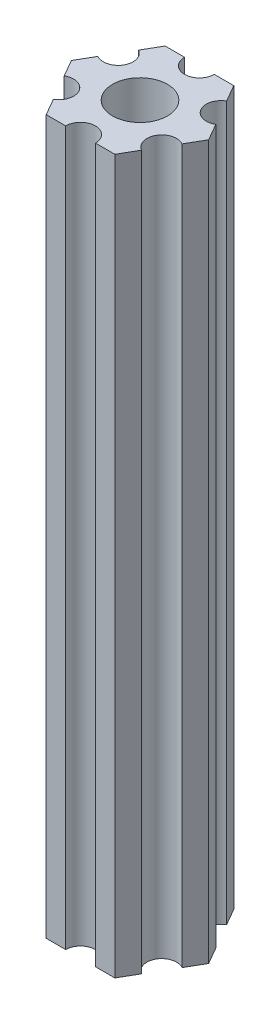
ISO-10303-21;
HEADER;
FILE_DESCRIPTION(('STEP AP214'),'2;1');
FILE_NAME('part.step','',(''),(''),'','','');
FILE_SCHEMA(('AUTOMOTIVE_DESIGN { 1 0 10303 214 1 1 1 1 }'));
ENDSEC;
DATA;
#1=APPLICATION_CONTEXT('core data for automotive mechanical design processes');
#2=APPLICATION_PROTOCOL_DEFINITION('international standard','automotive_design',2000,#1);
#3=PRODUCT_CONTEXT('',#1,'mechanical');
#4=PRODUCT('Part','Part','',(#3));
#5=PRODUCT_RELATED_PRODUCT_CATEGORY('part','',(#4));
#6=PRODUCT_DEFINITION_FORMATION('','',#4);
#7=PRODUCT_DEFINITION_CONTEXT('part definition',#1,'design');
#8=PRODUCT_DEFINITION('design','',#6,#7);
#9=PRODUCT_DEFINITION_SHAPE('','',#8);
#10=(LENGTH_UNIT() NAMED_UNIT(*) SI_UNIT(.MILLI.,.METRE.));
#11=(NAMED_UNIT(*) PLANE_ANGLE_UNIT() SI_UNIT($,.RADIAN.));
#12=(NAMED_UNIT(*) SI_UNIT($,.STERADIAN.) SOLID_ANGLE_UNIT());
#13=UNCERTAINTY_MEASURE_WITH_UNIT(LENGTH_MEASURE(1.E-05),#10,'distance_accuracy_value','');
#14=(GEOMETRIC_REPRESENTATION_CONTEXT(3) GLOBAL_UNCERTAINTY_ASSIGNED_CONTEXT((#13)) GLOBAL_UNIT_ASSIGNED_CONTEXT((#10,
#11,#12)) REPRESENTATION_CONTEXT('',''));
#15=CARTESIAN_POINT('',(0.,0.,0.));
#16=DIRECTION('',(0.,0.,1.));
#17=DIRECTION('',(1.,0.,0.));
#18=AXIS2_PLACEMENT_3D('',#15,#16,#17);
#19=CARTESIAN_POINT('',(-5.49926150638083,76.2,3.17499966684068));
#20=DIRECTION('',(0.,-1.,0.));
#21=DIRECTION('',(0.,0.,-1.));
#22=AXIS2_PLACEMENT_3D('',#19,#20,#21);
#23=PLANE('',#22);
#24=CARTESIAN_POINT('',(-5.49926150638083,76.2,3.17499966684068));
#25=DIRECTION('',(0.,-1.,0.));
#26=DIRECTION('',(0.,0.,-1.));
#27=AXIS2_PLACEMENT_3D('',#24,#25,#26);
#28=CIRCLE('',#27,1.58750000000001);
#29=CARTESIAN_POINT('',(-6.29301142309098,76.2,1.80018429024546));
#30=VERTEX_POINT('',#29);
#31=CARTESIAN_POINT('',(-4.70551158967068,76.2,4.54981504343589));
#32=VERTEX_POINT('',#31);
#33=EDGE_CURVE('E230',#30,#32,#28,.T.);
#34=ORIENTED_EDGE('',*,*,#33,.T.);
#35=DIRECTION('',(0.499999947533953,0.,0.866025434075723));
#36=VECTOR('',#35,1.);
#37=CARTESIAN_POINT('',(-4.70551158967068,76.2,4.54981504343589));
#38=LINE('',#37,#36);
#39=CARTESIAN_POINT('',(-3.66617452134693,76.2,6.34999990382519));
#40=VERTEX_POINT('',#39);
#41=EDGE_CURVE('E128',#32,#40,#38,.T.);
#42=ORIENTED_EDGE('',*,*,#41,.T.);
#43=DIRECTION('',(1.,0.,0.));
#44=VECTOR('',#43,1.);
#45=CARTESIAN_POINT('',(-3.66617452134693,76.2,6.34999990382519));
#46=LINE('',#45,#44);
#47=CARTESIAN_POINT('',(-1.58750192349631,76.2,6.34999990382519));
#48=VERTEX_POINT('',#47);
#49=EDGE_CURVE('E275',#40,#48,#46,.T.);
#50=ORIENTED_EDGE('',*,*,#49,.T.);
#51=CARTESIAN_POINT('',(-3.84699262029331E-07,76.2,6.34999990382519));
#52=DIRECTION('',(0.,-1.,0.));
#53=DIRECTION('',(0.,0.,-1.));
#54=AXIS2_PLACEMENT_3D('',#51,#52,#53);
#55=CIRCLE('',#54,1.58750153879705);
#56=CARTESIAN_POINT('',(1.58750153879705,76.2,6.34999990382519));
#57=VERTEX_POINT('',#56);
#58=EDGE_CURVE('E294',#48,#57,#55,.T.);
#59=ORIENTED_EDGE('',*,*,#58,.T.);
#60=DIRECTION('',(1.,0.,0.));
#61=VECTOR('',#60,1.);
#62=CARTESIAN_POINT('',(1.58750153879705,76.2,6.34999990382519));
#63=LINE('',#62,#61);
#64=CARTESIAN_POINT('',(3.66617382465481,76.2,6.34999990382519));
#65=VERTEX_POINT('',#64);
#66=EDGE_CURVE('E291',#57,#65,#63,.T.);
#67=ORIENTED_EDGE('',*,*,#66,.T.);
#68=DIRECTION('',(0.5,0.,-0.866025403784439));
#69=VECTOR('',#68,1.);
#70=CARTESIAN_POINT('',(3.66617382465481,76.2,6.34999990382519));
#71=LINE('',#70,#69);
#72=CARTESIAN_POINT('',(4.70551092933191,76.2,4.54981523233291));
#73=VERTEX_POINT('',#72);
#74=EDGE_CURVE('E293',#65,#73,#71,.T.);
#75=ORIENTED_EDGE('',*,*,#74,.T.);
#76=CARTESIAN_POINT('',(5.49926092933191,76.2,3.17499990382512));
#77=DIRECTION('',(0.,-1.,0.));
#78=DIRECTION('',(0.,0.,-1.));
#79=AXIS2_PLACEMENT_3D('',#76,#77,#78);
#80=CIRCLE('',#79,1.5875);
#81=CARTESIAN_POINT('',(6.29301092933191,76.2,1.80018457531732));
#82=VERTEX_POINT('',#81);
#83=EDGE_CURVE('E296',#73,#82,#80,.T.);
#84=ORIENTED_EDGE('',*,*,#83,.T.);
#85=DIRECTION('',(0.5,0.,-0.866025403784438));
#86=VECTOR('',#85,1.);
#87=CARTESIAN_POINT('',(6.29301092933191,76.2,1.80018457531732));
#88=LINE('',#87,#86);
#89=CARTESIAN_POINT('',(7.33234803400895,76.2,-9.61748367576953E-08));
#90=VERTEX_POINT('',#89);
#91=EDGE_CURVE('E302',#82,#90,#88,.T.);
#92=ORIENTED_EDGE('',*,*,#91,.T.);
#93=DIRECTION('',(-0.499999921300921,0.,-0.866025449221368));
#94=VECTOR('',#93,1.);
#95=CARTESIAN_POINT('',(7.33234803400895,76.2,-9.61748367576953E-08));
#96=LINE('',#95,#94);
#97=CARTESIAN_POINT('',(6.29301117773375,76.2,-1.80018471521667));
#98=VERTEX_POINT('',#97);
#99=EDGE_CURVE('E304',#90,#98,#96,.T.);
#100=ORIENTED_EDGE('',*,*,#99,.T.);
#101=CARTESIAN_POINT('',(5.49926130266854,76.2,-3.1750001158556));
#102=DIRECTION('',(0.,-1.,0.));
#103=DIRECTION('',(0.,0.,-1.));
#104=AXIS2_PLACEMENT_3D('',#101,#102,#103);
#105=CIRCLE('',#104,1.5875);
#106=CARTESIAN_POINT('',(4.70551142760333,76.2,-4.54981551649452));
#107=VERTEX_POINT('',#106);
#108=EDGE_CURVE('E306',#98,#107,#105,.T.);
#109=ORIENTED_EDGE('',*,*,#108,.T.);
#110=DIRECTION('',(-0.499999921300921,0.,-0.866025449221368));
#111=VECTOR('',#110,1.);
#112=CARTESIAN_POINT('',(4.70551142760333,76.2,-4.54981551649452));
#113=LINE('',#112,#111);
#114=CARTESIAN_POINT('',(3.66617452134701,76.2,-6.35000022210623));
#115=VERTEX_POINT('',#114);
#116=EDGE_CURVE('E308',#107,#115,#113,.T.);
#117=ORIENTED_EDGE('',*,*,#116,.T.);
#118=DIRECTION('',(-1.,0.,0.));
#119=VECTOR('',#118,1.);
#120=CARTESIAN_POINT('',(3.66617452134701,76.2,-6.35000022210623));
#121=LINE('',#120,#119);
#122=CARTESIAN_POINT('',(1.58749884590197,76.2,-6.35000022210623));
#123=VERTEX_POINT('',#122);
#124=EDGE_CURVE('E310',#115,#123,#121,.T.);
#125=ORIENTED_EDGE('',*,*,#124,.T.);
#126=CARTESIAN_POINT('',(3.84699344862377E-07,76.2,-6.35000022210623));
#127=DIRECTION('',(0.,-1.,0.));
#128=DIRECTION('',(0.,0.,-1.));
#129=AXIS2_PLACEMENT_3D('',#126,#127,#128);
#130=CIRCLE('',#129,1.58749846120262);
#131=CARTESIAN_POINT('',(-1.58749846120262,76.2,-6.35000022210623));
#132=VERTEX_POINT('',#131);
#133=EDGE_CURVE('E312',#123,#132,#130,.T.);
#134=ORIENTED_EDGE('',*,*,#133,.T.);
#135=DIRECTION('',(-1.,0.,0.));
#136=VECTOR('',#135,1.);
#137=CARTESIAN_POINT('',(-1.58749846120262,76.2,-6.35000022210623));
#138=LINE('',#137,#136);
#139=CARTESIAN_POINT('',(-3.66617382465472,76.2,-6.35000022210623));
#140=VERTEX_POINT('',#139);
#141=EDGE_CURVE('E314',#132,#140,#138,.T.);
#142=ORIENTED_EDGE('',*,*,#141,.T.);
#143=DIRECTION('',(-0.500000052466056,0.,0.866025373493145));
#144=VECTOR('',#143,1.);
#145=CARTESIAN_POINT('',(-3.66617382465472,76.2,-6.35000022210623));
#146=LINE('',#145,#144);
#147=CARTESIAN_POINT('',(-4.70551103839166,76.2,-4.54981561357968));
#148=VERTEX_POINT('',#147);
#149=EDGE_CURVE('E177',#140,#148,#146,.T.);
#150=ORIENTED_EDGE('',*,*,#149,.T.);
#151=CARTESIAN_POINT('',(-5.49926112168152,76.2,-3.17500033315932));
#152=DIRECTION('',(0.,-1.,0.));
#153=DIRECTION('',(0.,0.,-1.));
#154=AXIS2_PLACEMENT_3D('',#151,#152,#153);
#155=CIRCLE('',#154,1.5875);
#156=CARTESIAN_POINT('',(-6.29301120497139,76.2,-1.80018505273895));
#157=VERTEX_POINT('',#156);
#158=EDGE_CURVE('E171',#148,#157,#155,.T.);
#159=ORIENTED_EDGE('',*,*,#158,.T.);
#160=DIRECTION('',(-0.500000052466056,0.,0.866025373493145));
#161=VECTOR('',#160,1.);
#162=CARTESIAN_POINT('',(-6.29301120497139,76.2,-1.80018505273895));
#163=LINE('',#162,#161);
#164=CARTESIAN_POINT('',(-7.33234841870826,76.2,-4.44212518331544E-07));
#165=VERTEX_POINT('',#164);
#166=EDGE_CURVE('E175',#157,#165,#163,.T.);
#167=ORIENTED_EDGE('',*,*,#166,.T.);
#168=DIRECTION('',(0.499999947533953,0.,0.866025434075723));
#169=VECTOR('',#168,1.);
#170=CARTESIAN_POINT('',(-7.33234841870826,76.2,-4.44212518331544E-07));
#171=LINE('',#170,#169);
#172=EDGE_CURVE('E55',#165,#30,#171,.T.);
#173=ORIENTED_EDGE('',*,*,#172,.T.);
#174=EDGE_LOOP('',(#34,#42,#50,#59,#67,#75,#84,#92,#100,#109,#117,#125,#134,#142,#150,#159,#167,#173));
#175=FACE_BOUND('',#174,.T.);
#176=CARTESIAN_POINT('',(0.,76.2,0.));
#177=DIRECTION('',(0.,1.,0.));
#178=DIRECTION('',(0.,0.,-1.));
#179=AXIS2_PLACEMENT_3D('',#176,#177,#178);
#180=CIRCLE('',#179,2.9337);
#181=CARTESIAN_POINT('',(0.,76.2,-2.9337));
#182=VERTEX_POINT('',#181);
#183=EDGE_CURVE('E199',#182,#182,#180,.T.);
#184=ORIENTED_EDGE('',*,*,#183,.F.);
#185=EDGE_LOOP('',(#184));
#186=FACE_BOUND('',#185,.T.);
#187=ADVANCED_FACE('F38',(#175,#186),#23,.F.);
#188=CARTESIAN_POINT('',(-5.49926150638083,0.,3.17499966684068));
#189=DIRECTION('',(0.,-1.,0.));
#190=DIRECTION('',(0.,0.,-1.));
#191=AXIS2_PLACEMENT_3D('',#188,#189,#190);
#192=PLANE('',#191);
#193=CARTESIAN_POINT('',(-5.49926150638083,0.,3.17499966684068));
#194=DIRECTION('',(0.,-1.,0.));
#195=DIRECTION('',(0.,0.,-1.));
#196=AXIS2_PLACEMENT_3D('',#193,#194,#195);
#197=CIRCLE('',#196,1.58750000000001);
#198=CARTESIAN_POINT('',(-6.29301142309098,0.,1.80018429024546));
#199=VERTEX_POINT('',#198);
#200=CARTESIAN_POINT('',(-4.70551158967068,0.,4.54981504343589));
#201=VERTEX_POINT('',#200);
#202=EDGE_CURVE('E195',#199,#201,#197,.T.);
#203=ORIENTED_EDGE('',*,*,#202,.F.);
#204=DIRECTION('',(0.499999947533953,0.,0.866025434075723));
#205=VECTOR('',#204,1.);
#206=CARTESIAN_POINT('',(-7.33234841870826,0.,-4.44212518331544E-07));
#207=LINE('',#206,#205);
#208=CARTESIAN_POINT('',(-7.33234841870826,0.,-4.44212518331544E-07));
#209=VERTEX_POINT('',#208);
#210=EDGE_CURVE('E120',#209,#199,#207,.T.);
#211=ORIENTED_EDGE('',*,*,#210,.F.);
#212=DIRECTION('',(-0.500000052466056,0.,0.866025373493145));
#213=VECTOR('',#212,1.);
#214=CARTESIAN_POINT('',(-6.29301120497139,0.,-1.80018505273895));
#215=LINE('',#214,#213);
#216=CARTESIAN_POINT('',(-6.29301120497139,0.,-1.80018505273895));
#217=VERTEX_POINT('',#216);
#218=EDGE_CURVE('E114',#217,#209,#215,.T.);
#219=ORIENTED_EDGE('',*,*,#218,.F.);
#220=CARTESIAN_POINT('',(-5.49926112168152,0.,-3.17500033315932));
#221=DIRECTION('',(0.,-1.,0.));
#222=DIRECTION('',(0.,0.,-1.));
#223=AXIS2_PLACEMENT_3D('',#220,#221,#222);
#224=CIRCLE('',#223,1.5875);
#225=CARTESIAN_POINT('',(-4.70551103839166,0.,-4.54981561357968));
#226=VERTEX_POINT('',#225);
#227=EDGE_CURVE('E185',#226,#217,#224,.T.);
#228=ORIENTED_EDGE('',*,*,#227,.F.);
#229=DIRECTION('',(-0.500000052466056,0.,0.866025373493145));
#230=VECTOR('',#229,1.);
#231=CARTESIAN_POINT('',(-3.66617382465472,0.,-6.35000022210623));
#232=LINE('',#231,#230);
#233=CARTESIAN_POINT('',(-3.66617382465472,0.,-6.35000022210623));
#234=VERTEX_POINT('',#233);
#235=EDGE_CURVE('E225',#234,#226,#232,.T.);
#236=ORIENTED_EDGE('',*,*,#235,.F.);
#237=DIRECTION('',(-1.,0.,0.));
#238=VECTOR('',#237,1.);
#239=CARTESIAN_POINT('',(-1.58749846120262,0.,-6.35000022210623));
#240=LINE('',#239,#238);
#241=CARTESIAN_POINT('',(-1.58749846120262,0.,-6.35000022210623));
#242=VERTEX_POINT('',#241);
#243=EDGE_CURVE('E223',#242,#234,#240,.T.);
#244=ORIENTED_EDGE('',*,*,#243,.F.);
#245=CARTESIAN_POINT('',(3.84699344862377E-07,0.,-6.35000022210623));
#246=DIRECTION('',(0.,-1.,0.));
#247=DIRECTION('',(0.,0.,-1.));
#248=AXIS2_PLACEMENT_3D('',#245,#246,#247);
#249=CIRCLE('',#248,1.58749846120262);
#250=CARTESIAN_POINT('',(1.58749884590197,0.,-6.35000022210623));
#251=VERTEX_POINT('',#250);
#252=EDGE_CURVE('E221',#251,#242,#249,.T.);
#253=ORIENTED_EDGE('',*,*,#252,.F.);
#254=DIRECTION('',(-1.,0.,0.));
#255=VECTOR('',#254,1.);
#256=CARTESIAN_POINT('',(3.66617452134701,0.,-6.35000022210623));
#257=LINE('',#256,#255);
#258=CARTESIAN_POINT('',(3.66617452134701,0.,-6.35000022210623));
#259=VERTEX_POINT('',#258);
#260=EDGE_CURVE('E219',#259,#251,#257,.T.);
#261=ORIENTED_EDGE('',*,*,#260,.F.);
#262=DIRECTION('',(-0.499999921300921,0.,-0.866025449221368));
#263=VECTOR('',#262,1.);
#264=CARTESIAN_POINT('',(4.70551142760333,0.,-4.54981551649452));
#265=LINE('',#264,#263);
#266=CARTESIAN_POINT('',(4.70551142760333,0.,-4.54981551649452));
#267=VERTEX_POINT('',#266);
#268=EDGE_CURVE('E217',#267,#259,#265,.T.);
#269=ORIENTED_EDGE('',*,*,#268,.F.);
#270=CARTESIAN_POINT('',(5.49926130266854,0.,-3.1750001158556));
#271=DIRECTION('',(0.,-1.,0.));
#272=DIRECTION('',(0.,0.,-1.));
#273=AXIS2_PLACEMENT_3D('',#270,#271,#272);
#274=CIRCLE('',#273,1.5875);
#275=CARTESIAN_POINT('',(6.29301117773375,0.,-1.80018471521667));
#276=VERTEX_POINT('',#275);
#277=EDGE_CURVE('E215',#276,#267,#274,.T.);
#278=ORIENTED_EDGE('',*,*,#277,.F.);
#279=DIRECTION('',(-0.499999921300921,0.,-0.866025449221368));
#280=VECTOR('',#279,1.);
#281=CARTESIAN_POINT('',(7.33234803400895,0.,-9.61748367576953E-08));
#282=LINE('',#281,#280);
#283=CARTESIAN_POINT('',(7.33234803400895,0.,-9.61748367576953E-08));
#284=VERTEX_POINT('',#283);
#285=EDGE_CURVE('E213',#284,#276,#282,.T.);
#286=ORIENTED_EDGE('',*,*,#285,.F.);
#287=DIRECTION('',(0.5,0.,-0.866025403784438));
#288=VECTOR('',#287,1.);
#289=CARTESIAN_POINT('',(6.29301092933191,0.,1.80018457531732));
#290=LINE('',#289,#288);
#291=CARTESIAN_POINT('',(6.29301092933191,0.,1.80018457531732));
#292=VERTEX_POINT('',#291);
#293=EDGE_CURVE('E211',#292,#284,#290,.T.);
#294=ORIENTED_EDGE('',*,*,#293,.F.);
#295=CARTESIAN_POINT('',(5.49926092933191,0.,3.17499990382512));
#296=DIRECTION('',(0.,-1.,0.));
#297=DIRECTION('',(0.,0.,-1.));
#298=AXIS2_PLACEMENT_3D('',#295,#296,#297);
#299=CIRCLE('',#298,1.5875);
#300=CARTESIAN_POINT('',(4.70551092933191,0.,4.54981523233291));
#301=VERTEX_POINT('',#300);
#302=EDGE_CURVE('E209',#301,#292,#299,.T.);
#303=ORIENTED_EDGE('',*,*,#302,.F.);
#304=DIRECTION('',(0.5,0.,-0.866025403784439));
#305=VECTOR('',#304,1.);
#306=CARTESIAN_POINT('',(3.66617382465481,0.,6.34999990382519));
#307=LINE('',#306,#305);
#308=CARTESIAN_POINT('',(3.66617382465481,0.,6.34999990382519));
#309=VERTEX_POINT('',#308);
#310=EDGE_CURVE('E207',#309,#301,#307,.T.);
#311=ORIENTED_EDGE('',*,*,#310,.F.);
#312=DIRECTION('',(1.,0.,0.));
#313=VECTOR('',#312,1.);
#314=CARTESIAN_POINT('',(1.58750153879705,0.,6.34999990382519));
#315=LINE('',#314,#313);
#316=CARTESIAN_POINT('',(1.58750153879705,0.,6.34999990382519));
#317=VERTEX_POINT('',#316);
#318=EDGE_CURVE('E205',#317,#309,#315,.T.);
#319=ORIENTED_EDGE('',*,*,#318,.F.);
#320=CARTESIAN_POINT('',(-3.84699262029331E-07,0.,6.34999990382519));
#321=DIRECTION('',(0.,-1.,0.));
#322=DIRECTION('',(0.,0.,-1.));
#323=AXIS2_PLACEMENT_3D('',#320,#321,#322);
#324=CIRCLE('',#323,1.58750153879705);
#325=CARTESIAN_POINT('',(-1.58750192349631,0.,6.34999990382519));
#326=VERTEX_POINT('',#325);
#327=EDGE_CURVE('E203',#326,#317,#324,.T.);
#328=ORIENTED_EDGE('',*,*,#327,.F.);
#329=DIRECTION('',(1.,0.,0.));
#330=VECTOR('',#329,1.);
#331=CARTESIAN_POINT('',(-3.66617452134693,0.,6.34999990382519));
#332=LINE('',#331,#330);
#333=CARTESIAN_POINT('',(-3.66617452134693,0.,6.34999990382519));
#334=VERTEX_POINT('',#333);
#335=EDGE_CURVE('E201',#334,#326,#332,.T.);
#336=ORIENTED_EDGE('',*,*,#335,.F.);
#337=DIRECTION('',(0.499999947533953,0.,0.866025434075723));
#338=VECTOR('',#337,1.);
#339=CARTESIAN_POINT('',(-4.70551158967068,0.,4.54981504343589));
#340=LINE('',#339,#338);
#341=EDGE_CURVE('E198',#201,#334,#340,.T.);
#342=ORIENTED_EDGE('',*,*,#341,.F.);
#343=EDGE_LOOP('',(#203,#211,#219,#228,#236,#244,#253,#261,#269,#278,#286,#294,#303,#311,#319,
#328,#336,#342));
#344=FACE_BOUND('',#343,.T.);
#345=CARTESIAN_POINT('',(0.,0.,0.));
#346=DIRECTION('',(0.,1.,0.));
#347=DIRECTION('',(0.,0.,-1.));
#348=AXIS2_PLACEMENT_3D('',#345,#346,#347);
#349=CIRCLE('',#348,2.9337);
#350=CARTESIAN_POINT('',(0.,0.,-2.9337));
#351=VERTEX_POINT('',#350);
#352=EDGE_CURVE('E581',#351,#351,#349,.T.);
#353=ORIENTED_EDGE('',*,*,#352,.T.);
#354=EDGE_LOOP('',(#353));
#355=FACE_BOUND('',#354,.T.);
#356=ADVANCED_FACE('F279',(#344,#355),#192,.T.);
#357=CARTESIAN_POINT('',(-5.49926150638083,76.2,3.17499966684068));
#358=DIRECTION('',(0.,-1.,0.));
#359=DIRECTION('',(0.,0.,-1.));
#360=AXIS2_PLACEMENT_3D('',#357,#358,#359);
#361=CYLINDRICAL_SURFACE('',#360,1.58750000000001);
#362=ORIENTED_EDGE('',*,*,#202,.T.);
#363=DIRECTION('',(0.,-1.,0.));
#364=VECTOR('',#363,1.);
#365=CARTESIAN_POINT('',(-4.70551158967068,76.2,4.54981504343589));
#366=LINE('',#365,#364);
#367=EDGE_CURVE('E11',#32,#201,#366,.T.);
#368=ORIENTED_EDGE('',*,*,#367,.F.);
#369=ORIENTED_EDGE('',*,*,#33,.F.);
#370=DIRECTION('',(0.,-1.,0.));
#371=VECTOR('',#370,1.);
#372=CARTESIAN_POINT('',(-6.29301142309098,76.2,1.80018429024546));
#373=LINE('',#372,#371);
#374=EDGE_CURVE('E191',#30,#199,#373,.T.);
#375=ORIENTED_EDGE('',*,*,#374,.T.);
#376=EDGE_LOOP('',(#362,#368,#369,#375));
#377=FACE_BOUND('',#376,.T.);
#378=ADVANCED_FACE('F40',(#377),#361,.F.);
#379=CARTESIAN_POINT('',(-4.70551158967068,76.2,4.54981504343589));
#380=DIRECTION('',(0.866025434075723,0.,-0.499999947533953));
#381=DIRECTION('',(-0.499999947533953,0.,-0.866025434075723));
#382=AXIS2_PLACEMENT_3D('',#379,#380,#381);
#383=PLANE('',#382);
#384=ORIENTED_EDGE('',*,*,#341,.T.);
#385=DIRECTION('',(0.,-1.,0.));
#386=VECTOR('',#385,1.);
#387=CARTESIAN_POINT('',(-3.66617452134693,76.2,6.34999990382519));
#388=LINE('',#387,#386);
#389=EDGE_CURVE('E47',#40,#334,#388,.T.);
#390=ORIENTED_EDGE('',*,*,#389,.F.);
#391=ORIENTED_EDGE('',*,*,#41,.F.);
#392=ORIENTED_EDGE('',*,*,#367,.T.);
#393=EDGE_LOOP('',(#384,#390,#391,#392));
#394=FACE_BOUND('',#393,.T.);
#395=ADVANCED_FACE('F348',(#394),#383,.F.);
#396=CARTESIAN_POINT('',(-3.66617452134693,76.2,6.34999990382519));
#397=DIRECTION('',(0.,0.,-1.));
#398=DIRECTION('',(-1.,0.,0.));
#399=AXIS2_PLACEMENT_3D('',#396,#397,#398);
#400=PLANE('',#399);
#401=ORIENTED_EDGE('',*,*,#335,.T.);
#402=DIRECTION('',(0.,-1.,0.));
#403=VECTOR('',#402,1.);
#404=CARTESIAN_POINT('',(-1.58750192349631,76.2,6.34999990382519));
#405=LINE('',#404,#403);
#406=EDGE_CURVE('E267',#48,#326,#405,.T.);
#407=ORIENTED_EDGE('',*,*,#406,.F.);
#408=ORIENTED_EDGE('',*,*,#49,.F.);
#409=ORIENTED_EDGE('',*,*,#389,.T.);
#410=EDGE_LOOP('',(#401,#407,#408,#409));
#411=FACE_BOUND('',#410,.T.);
#412=ADVANCED_FACE('F273',(#411),#400,.F.);
#413=CARTESIAN_POINT('',(-3.84699262029331E-07,76.2,6.34999990382519));
#414=DIRECTION('',(0.,-1.,0.));
#415=DIRECTION('',(0.,0.,-1.));
#416=AXIS2_PLACEMENT_3D('',#413,#414,#415);
#417=CYLINDRICAL_SURFACE('',#416,1.58750153879705);
#418=ORIENTED_EDGE('',*,*,#327,.T.);
#419=DIRECTION('',(0.,-1.,0.));
#420=VECTOR('',#419,1.);
#421=CARTESIAN_POINT('',(1.58750153879705,76.2,6.34999990382519));
#422=LINE('',#421,#420);
#423=EDGE_CURVE('E264',#57,#317,#422,.T.);
#424=ORIENTED_EDGE('',*,*,#423,.F.);
#425=ORIENTED_EDGE('',*,*,#58,.F.);
#426=ORIENTED_EDGE('',*,*,#406,.T.);
#427=EDGE_LOOP('',(#418,#424,#425,#426));
#428=FACE_BOUND('',#427,.T.);
#429=ADVANCED_FACE('F285',(#428),#417,.F.);
#430=CARTESIAN_POINT('',(1.58750153879705,76.2,6.34999990382519));
#431=DIRECTION('',(0.,0.,-1.));
#432=DIRECTION('',(-1.,0.,0.));
#433=AXIS2_PLACEMENT_3D('',#430,#431,#432);
#434=PLANE('',#433);
#435=ORIENTED_EDGE('',*,*,#318,.T.);
#436=DIRECTION('',(0.,-1.,0.));
#437=VECTOR('',#436,1.);
#438=CARTESIAN_POINT('',(3.66617382465481,76.2,6.34999990382519));
#439=LINE('',#438,#437);
#440=EDGE_CURVE('E261',#65,#309,#439,.T.);
#441=ORIENTED_EDGE('',*,*,#440,.F.);
#442=ORIENTED_EDGE('',*,*,#66,.F.);
#443=ORIENTED_EDGE('',*,*,#423,.T.);
#444=EDGE_LOOP('',(#435,#441,#442,#443));
#445=FACE_BOUND('',#444,.T.);
#446=ADVANCED_FACE('F289',(#445),#434,.F.);
#447=CARTESIAN_POINT('',(3.66617382465481,76.2,6.34999990382519));
#448=DIRECTION('',(-0.866025403784439,0.,-0.5));
#449=DIRECTION('',(-0.5,0.,0.866025403784439));
#450=AXIS2_PLACEMENT_3D('',#447,#448,#449);
#451=PLANE('',#450);
#452=ORIENTED_EDGE('',*,*,#310,.T.);
#453=DIRECTION('',(0.,-1.,0.));
#454=VECTOR('',#453,1.);
#455=CARTESIAN_POINT('',(4.70551092933191,76.2,4.54981523233291));
#456=LINE('',#455,#454);
#457=EDGE_CURVE('E258',#73,#301,#456,.T.);
#458=ORIENTED_EDGE('',*,*,#457,.F.);
#459=ORIENTED_EDGE('',*,*,#74,.F.);
#460=ORIENTED_EDGE('',*,*,#440,.T.);
#461=EDGE_LOOP('',(#452,#458,#459,#460));
#462=FACE_BOUND('',#461,.T.);
#463=ADVANCED_FACE('F361',(#462),#451,.F.);
#464=CARTESIAN_POINT('',(5.49926092933191,76.2,3.17499990382512));
#465=DIRECTION('',(0.,-1.,0.));
#466=DIRECTION('',(0.,0.,-1.));
#467=AXIS2_PLACEMENT_3D('',#464,#465,#466);
#468=CYLINDRICAL_SURFACE('',#467,1.5875);
#469=ORIENTED_EDGE('',*,*,#302,.T.);
#470=DIRECTION('',(0.,-1.,0.));
#471=VECTOR('',#470,1.);
#472=CARTESIAN_POINT('',(6.29301092933191,76.2,1.80018457531732));
#473=LINE('',#472,#471);
#474=EDGE_CURVE('E255',#82,#292,#473,.T.);
#475=ORIENTED_EDGE('',*,*,#474,.F.);
#476=ORIENTED_EDGE('',*,*,#83,.F.);
#477=ORIENTED_EDGE('',*,*,#457,.T.);
#478=EDGE_LOOP('',(#469,#475,#476,#477));
#479=FACE_BOUND('',#478,.T.);
#480=ADVANCED_FACE('F364',(#479),#468,.F.);
#481=CARTESIAN_POINT('',(6.29301092933191,76.2,1.80018457531732));
#482=DIRECTION('',(-0.866025403784438,0.,-0.5));
#483=DIRECTION('',(-0.5,0.,0.866025403784438));
#484=AXIS2_PLACEMENT_3D('',#481,#482,#483);
#485=PLANE('',#484);
#486=ORIENTED_EDGE('',*,*,#293,.T.);
#487=DIRECTION('',(0.,-1.,0.));
#488=VECTOR('',#487,1.);
#489=CARTESIAN_POINT('',(7.33234803400895,76.2,-9.61748367576953E-08));
#490=LINE('',#489,#488);
#491=EDGE_CURVE('E252',#90,#284,#490,.T.);
#492=ORIENTED_EDGE('',*,*,#491,.F.);
#493=ORIENTED_EDGE('',*,*,#91,.F.);
#494=ORIENTED_EDGE('',*,*,#474,.T.);
#495=EDGE_LOOP('',(#486,#492,#493,#494));
#496=FACE_BOUND('',#495,.T.);
#497=ADVANCED_FACE('F368',(#496),#485,.F.);
#498=CARTESIAN_POINT('',(7.33234803400895,76.2,-9.61748367576953E-08));
#499=DIRECTION('',(-0.866025449221368,0.,0.499999921300921));
#500=DIRECTION('',(0.499999921300922,0.,0.866025449221368));
#501=AXIS2_PLACEMENT_3D('',#498,#499,#500);
#502=PLANE('',#501);
#503=ORIENTED_EDGE('',*,*,#285,.T.);
#504=DIRECTION('',(0.,-1.,0.));
#505=VECTOR('',#504,1.);
#506=CARTESIAN_POINT('',(6.29301117773375,76.2,-1.80018471521667));
#507=LINE('',#506,#505);
#508=EDGE_CURVE('E249',#98,#276,#507,.T.);
#509=ORIENTED_EDGE('',*,*,#508,.F.);
#510=ORIENTED_EDGE('',*,*,#99,.F.);
#511=ORIENTED_EDGE('',*,*,#491,.T.);
#512=EDGE_LOOP('',(#503,#509,#510,#511));
#513=FACE_BOUND('',#512,.T.);
#514=ADVANCED_FACE('F372',(#513),#502,.F.);
#515=CARTESIAN_POINT('',(5.49926130266854,76.2,-3.1750001158556));
#516=DIRECTION('',(0.,-1.,0.));
#517=DIRECTION('',(0.,0.,-1.));
#518=AXIS2_PLACEMENT_3D('',#515,#516,#517);
#519=CYLINDRICAL_SURFACE('',#518,1.5875);
#520=ORIENTED_EDGE('',*,*,#277,.T.);
#521=DIRECTION('',(0.,-1.,0.));
#522=VECTOR('',#521,1.);
#523=CARTESIAN_POINT('',(4.70551142760333,76.2,-4.54981551649452));
#524=LINE('',#523,#522);
#525=EDGE_CURVE('E246',#107,#267,#524,.T.);
#526=ORIENTED_EDGE('',*,*,#525,.F.);
#527=ORIENTED_EDGE('',*,*,#108,.F.);
#528=ORIENTED_EDGE('',*,*,#508,.T.);
#529=EDGE_LOOP('',(#520,#526,#527,#528));
#530=FACE_BOUND('',#529,.T.);
#531=ADVANCED_FACE('F376',(#530),#519,.F.);
#532=CARTESIAN_POINT('',(4.70551142760333,76.2,-4.54981551649452));
#533=DIRECTION('',(-0.866025449221368,0.,0.499999921300922));
#534=DIRECTION('',(0.499999921300922,0.,0.866025449221368));
#535=AXIS2_PLACEMENT_3D('',#532,#533,#534);
#536=PLANE('',#535);
#537=ORIENTED_EDGE('',*,*,#268,.T.);
#538=DIRECTION('',(0.,-1.,0.));
#539=VECTOR('',#538,1.);
#540=CARTESIAN_POINT('',(3.66617452134701,76.2,-6.35000022210623));
#541=LINE('',#540,#539);
#542=EDGE_CURVE('E243',#115,#259,#541,.T.);
#543=ORIENTED_EDGE('',*,*,#542,.F.);
#544=ORIENTED_EDGE('',*,*,#116,.F.);
#545=ORIENTED_EDGE('',*,*,#525,.T.);
#546=EDGE_LOOP('',(#537,#543,#544,#545));
#547=FACE_BOUND('',#546,.T.);
#548=ADVANCED_FACE('F380',(#547),#536,.F.);
#549=CARTESIAN_POINT('',(3.66617452134701,76.2,-6.35000022210623));
#550=DIRECTION('',(0.,0.,1.));
#551=DIRECTION('',(1.,0.,0.));
#552=AXIS2_PLACEMENT_3D('',#549,#550,#551);
#553=PLANE('',#552);
#554=ORIENTED_EDGE('',*,*,#260,.T.);
#555=DIRECTION('',(0.,-1.,0.));
#556=VECTOR('',#555,1.);
#557=CARTESIAN_POINT('',(1.58749884590197,76.2,-6.35000022210623));
#558=LINE('',#557,#556);
#559=EDGE_CURVE('E240',#123,#251,#558,.T.);
#560=ORIENTED_EDGE('',*,*,#559,.F.);
#561=ORIENTED_EDGE('',*,*,#124,.F.);
#562=ORIENTED_EDGE('',*,*,#542,.T.);
#563=EDGE_LOOP('',(#554,#560,#561,#562));
#564=FACE_BOUND('',#563,.T.);
#565=ADVANCED_FACE('F384',(#564),#553,.F.);
#566=CARTESIAN_POINT('',(3.84699344862377E-07,76.2,-6.35000022210623));
#567=DIRECTION('',(0.,-1.,0.));
#568=DIRECTION('',(0.,0.,-1.));
#569=AXIS2_PLACEMENT_3D('',#566,#567,#568);
#570=CYLINDRICAL_SURFACE('',#569,1.58749846120262);
#571=ORIENTED_EDGE('',*,*,#252,.T.);
#572=DIRECTION('',(0.,-1.,0.));
#573=VECTOR('',#572,1.);
#574=CARTESIAN_POINT('',(-1.58749846120262,76.2,-6.35000022210623));
#575=LINE('',#574,#573);
#576=EDGE_CURVE('E237',#132,#242,#575,.T.);
#577=ORIENTED_EDGE('',*,*,#576,.F.);
#578=ORIENTED_EDGE('',*,*,#133,.F.);
#579=ORIENTED_EDGE('',*,*,#559,.T.);
#580=EDGE_LOOP('',(#571,#577,#578,#579));
#581=FACE_BOUND('',#580,.T.);
#582=ADVANCED_FACE('F388',(#581),#570,.F.);
#583=CARTESIAN_POINT('',(-1.58749846120262,76.2,-6.35000022210623));
#584=DIRECTION('',(0.,0.,1.));
#585=DIRECTION('',(1.,0.,0.));
#586=AXIS2_PLACEMENT_3D('',#583,#584,#585);
#587=PLANE('',#586);
#588=ORIENTED_EDGE('',*,*,#243,.T.);
#589=DIRECTION('',(0.,-1.,0.));
#590=VECTOR('',#589,1.);
#591=CARTESIAN_POINT('',(-3.66617382465472,76.2,-6.35000022210623));
#592=LINE('',#591,#590);
#593=EDGE_CURVE('E234',#140,#234,#592,.T.);
#594=ORIENTED_EDGE('',*,*,#593,.F.);
#595=ORIENTED_EDGE('',*,*,#141,.F.);
#596=ORIENTED_EDGE('',*,*,#576,.T.);
#597=EDGE_LOOP('',(#588,#594,#595,#596));
#598=FACE_BOUND('',#597,.T.);
#599=ADVANCED_FACE('F320',(#598),#587,.F.);
#600=CARTESIAN_POINT('',(-3.66617382465472,76.2,-6.35000022210623));
#601=DIRECTION('',(0.866025373493145,0.,0.500000052466056));
#602=DIRECTION('',(0.500000052466056,0.,-0.866025373493145));
#603=AXIS2_PLACEMENT_3D('',#600,#601,#602);
#604=PLANE('',#603);
#605=ORIENTED_EDGE('',*,*,#235,.T.);
#606=DIRECTION('',(0.,-1.,0.));
#607=VECTOR('',#606,1.);
#608=CARTESIAN_POINT('',(-4.70551103839166,76.2,-4.54981561357968));
#609=LINE('',#608,#607);
#610=EDGE_CURVE('E186',#148,#226,#609,.T.);
#611=ORIENTED_EDGE('',*,*,#610,.F.);
#612=ORIENTED_EDGE('',*,*,#149,.F.);
#613=ORIENTED_EDGE('',*,*,#593,.T.);
#614=EDGE_LOOP('',(#605,#611,#612,#613));
#615=FACE_BOUND('',#614,.T.);
#616=ADVANCED_FACE('F324',(#615),#604,.F.);
#617=CARTESIAN_POINT('',(-5.49926112168152,76.2,-3.17500033315932));
#618=DIRECTION('',(0.,-1.,0.));
#619=DIRECTION('',(0.,0.,-1.));
#620=AXIS2_PLACEMENT_3D('',#617,#618,#619);
#621=CYLINDRICAL_SURFACE('',#620,1.5875);
#622=ORIENTED_EDGE('',*,*,#227,.T.);
#623=DIRECTION('',(0.,-1.,0.));
#624=VECTOR('',#623,1.);
#625=CARTESIAN_POINT('',(-6.29301120497139,76.2,-1.80018505273895));
#626=LINE('',#625,#624);
#627=EDGE_CURVE('E182',#157,#217,#626,.T.);
#628=ORIENTED_EDGE('',*,*,#627,.F.);
#629=ORIENTED_EDGE('',*,*,#158,.F.);
#630=ORIENTED_EDGE('',*,*,#610,.T.);
#631=EDGE_LOOP('',(#622,#628,#629,#630));
#632=FACE_BOUND('',#631,.T.);
#633=ADVANCED_FACE('F183',(#632),#621,.F.);
#634=CARTESIAN_POINT('',(-6.29301120497139,76.2,-1.80018505273895));
#635=DIRECTION('',(0.866025373493145,0.,0.500000052466056));
#636=DIRECTION('',(0.500000052466056,0.,-0.866025373493145));
#637=AXIS2_PLACEMENT_3D('',#634,#635,#636);
#638=PLANE('',#637);
#639=ORIENTED_EDGE('',*,*,#218,.T.);
#640=DIRECTION('',(0.,-1.,0.));
#641=VECTOR('',#640,1.);
#642=CARTESIAN_POINT('',(-7.33234841870826,76.2,-4.44212518331544E-07));
#643=LINE('',#642,#641);
#644=EDGE_CURVE('E187',#165,#209,#643,.T.);
#645=ORIENTED_EDGE('',*,*,#644,.F.);
#646=ORIENTED_EDGE('',*,*,#166,.F.);
#647=ORIENTED_EDGE('',*,*,#627,.T.);
#648=EDGE_LOOP('',(#639,#645,#646,#647));
#649=FACE_BOUND('',#648,.T.);
#650=ADVANCED_FACE('F189',(#649),#638,.F.);
#651=CARTESIAN_POINT('',(-7.33234841870826,76.2,-4.44212518331544E-07));
#652=DIRECTION('',(0.866025434075723,0.,-0.499999947533953));
#653=DIRECTION('',(-0.499999947533953,0.,-0.866025434075723));
#654=AXIS2_PLACEMENT_3D('',#651,#652,#653);
#655=PLANE('',#654);
#656=ORIENTED_EDGE('',*,*,#210,.T.);
#657=ORIENTED_EDGE('',*,*,#374,.F.);
#658=ORIENTED_EDGE('',*,*,#172,.F.);
#659=ORIENTED_EDGE('',*,*,#644,.T.);
#660=EDGE_LOOP('',(#656,#657,#658,#659));
#661=FACE_BOUND('',#660,.T.);
#662=ADVANCED_FACE('F328',(#661),#655,.F.);
#663=CARTESIAN_POINT('',(0.,76.2,0.));
#664=DIRECTION('',(0.,-1.,0.));
#665=DIRECTION('',(0.,0.,-1.));
#666=AXIS2_PLACEMENT_3D('',#663,#664,#665);
#667=CYLINDRICAL_SURFACE('',#666,2.9337);
#668=CARTESIAN_POINT('',(0.,76.2,-2.9337));
#669=CARTESIAN_POINT('',(0.,75.40625,-2.9337));
#670=CARTESIAN_POINT('',(0.,74.6125,-2.9337));
#671=CARTESIAN_POINT('',(0.,73.025,-2.9337));
#672=CARTESIAN_POINT('',(0.,72.23125,-2.9337));
#673=CARTESIAN_POINT('',(0.,70.64375,-2.9337));
#674=CARTESIAN_POINT('',(0.,69.85,-2.9337));
#675=CARTESIAN_POINT('',(0.,68.2625,-2.9337));
#676=CARTESIAN_POINT('',(0.,67.46875,-2.9337));
#677=CARTESIAN_POINT('',(0.,65.88125,-2.9337));
#678=CARTESIAN_POINT('',(0.,65.0875,-2.9337));
#679=CARTESIAN_POINT('',(0.,63.5,-2.9337));
#680=CARTESIAN_POINT('',(0.,62.70625,-2.9337));
#681=CARTESIAN_POINT('',(0.,61.11875,-2.9337));
#682=CARTESIAN_POINT('',(0.,60.325,-2.9337));
#683=CARTESIAN_POINT('',(0.,58.7375,-2.9337));
#684=CARTESIAN_POINT('',(0.,57.94375,-2.9337));
#685=CARTESIAN_POINT('',(0.,56.35625,-2.9337));
#686=CARTESIAN_POINT('',(0.,55.5625,-2.9337));
#687=CARTESIAN_POINT('',(0.,53.975,-2.9337));
#688=CARTESIAN_POINT('',(0.,53.18125,-2.9337));
#689=CARTESIAN_POINT('',(0.,51.59375,-2.9337));
#690=CARTESIAN_POINT('',(0.,50.8,-2.9337));
#691=CARTESIAN_POINT('',(0.,49.2125,-2.9337));
#692=CARTESIAN_POINT('',(0.,48.41875,-2.9337));
#693=CARTESIAN_POINT('',(0.,46.83125,-2.9337));
#694=CARTESIAN_POINT('',(0.,46.0375,-2.9337));
#695=CARTESIAN_POINT('',(0.,44.45,-2.9337));
#696=CARTESIAN_POINT('',(0.,43.65625,-2.9337));
#697=CARTESIAN_POINT('',(0.,42.06875,-2.9337));
#698=CARTESIAN_POINT('',(0.,41.275,-2.9337));
#699=CARTESIAN_POINT('',(0.,39.6875,-2.9337));
#700=CARTESIAN_POINT('',(0.,38.89375,-2.9337));
#701=CARTESIAN_POINT('',(0.,37.30625,-2.9337));
#702=CARTESIAN_POINT('',(0.,36.5125,-2.9337));
#703=CARTESIAN_POINT('',(0.,34.925,-2.9337));
#704=CARTESIAN_POINT('',(0.,34.13125,-2.9337));
#705=CARTESIAN_POINT('',(0.,32.54375,-2.9337));
#706=CARTESIAN_POINT('',(0.,31.75,-2.9337));
#707=CARTESIAN_POINT('',(0.,30.1625,-2.9337));
#708=CARTESIAN_POINT('',(0.,29.36875,-2.9337));
#709=CARTESIAN_POINT('',(0.,27.78125,-2.9337));
#710=CARTESIAN_POINT('',(0.,26.9875,-2.9337));
#711=CARTESIAN_POINT('',(0.,25.4,-2.9337));
#712=CARTESIAN_POINT('',(0.,24.60625,-2.9337));
#713=CARTESIAN_POINT('',(0.,23.01875,-2.9337));
#714=CARTESIAN_POINT('',(0.,22.225,-2.9337));
#715=CARTESIAN_POINT('',(0.,20.6375,-2.9337));
#716=CARTESIAN_POINT('',(0.,19.84375,-2.9337));
#717=CARTESIAN_POINT('',(0.,18.25625,-2.9337));
#718=CARTESIAN_POINT('',(0.,17.4625,-2.9337));
#719=CARTESIAN_POINT('',(0.,15.875,-2.9337));
#720=CARTESIAN_POINT('',(0.,15.08125,-2.9337));
#721=CARTESIAN_POINT('',(0.,13.49375,-2.9337));
#722=CARTESIAN_POINT('',(0.,12.7,-2.9337));
#723=CARTESIAN_POINT('',(0.,11.1125,-2.9337));
#724=CARTESIAN_POINT('',(0.,10.31875,-2.9337));
#725=CARTESIAN_POINT('',(0.,8.73125,-2.9337));
#726=CARTESIAN_POINT('',(0.,7.93750000000001,-2.9337));
#727=CARTESIAN_POINT('',(0.,6.35,-2.9337));
#728=CARTESIAN_POINT('',(0.,5.55625,-2.9337));
#729=CARTESIAN_POINT('',(0.,3.96875,-2.9337));
#730=CARTESIAN_POINT('',(0.,3.175,-2.9337));
#731=CARTESIAN_POINT('',(0.,1.5875,-2.9337));
#732=CARTESIAN_POINT('',(0.,0.793750000000001,-2.9337));
#733=CARTESIAN_POINT('',(0.,0.,-2.9337));
#734=B_SPLINE_CURVE_WITH_KNOTS('',3,(#668,#669,#670,#671,#672,#673,#674,#675,#676,#677,#678,
#679,#680,#681,#682,#683,#684,#685,#686,#687,#688,#689,#690,#691,#692,#693,#694,#695,#696,#697,
#698,#699,#700,#701,#702,#703,#704,#705,#706,#707,#708,#709,#710,#711,#712,#713,#714,#715,#716,
#717,#718,#719,#720,#721,#722,#723,#724,#725,#726,#727,#728,#729,#730,#731,#732,#733),
.UNSPECIFIED.,.F.,.F.,(4,2,2,2,2,2,2,2,2,2,2,2,2,2,2,2,2,2,2,2,2,2,2,2,2,2,2,2,2,2,2,2,4),(0.,
2.38124999999999,4.76249999999999,7.14374999999999,9.52499999999999,11.90625,14.2875,16.66875,
19.05,21.43125,23.8125,26.19375,28.575,30.95625,33.3375,35.71875,38.1,40.48125,42.8625,45.24375,
47.625,50.00625,52.3875,54.76875,57.15,59.53125,61.9125,64.29375,66.675,69.05625,71.4375,
73.81875,76.2),.UNSPECIFIED.);
#735=EDGE_CURVE('BSEAM330',#182,#351,#734,.T.);
#736=ORIENTED_EDGE('',*,*,#183,.T.);
#737=ORIENTED_EDGE('',*,*,#352,.F.);
#738=ORIENTED_EDGE('',*,*,#735,.T.);
#739=ORIENTED_EDGE('',*,*,#735,.F.);
#740=EDGE_LOOP('',(#736,#738,#737,#739));
#741=FACE_BOUND('',#740,.T.);
#742=ADVANCED_FACE('F330',(#741),#667,.F.);
#743=CLOSED_SHELL('',(#187,#356,#378,#395,#412,#429,#446,#463,#480,#497,#514,#531,#548,#565,
#582,#599,#616,#633,#650,#662,#742));
#744=MANIFOLD_SOLID_BREP('B2',#743);
#745=ADVANCED_BREP_SHAPE_REPRESENTATION('',(#18,#744),#14);
#746=SHAPE_DEFINITION_REPRESENTATION(#9,#745);
ENDSEC;
END-ISO-10303-21;
